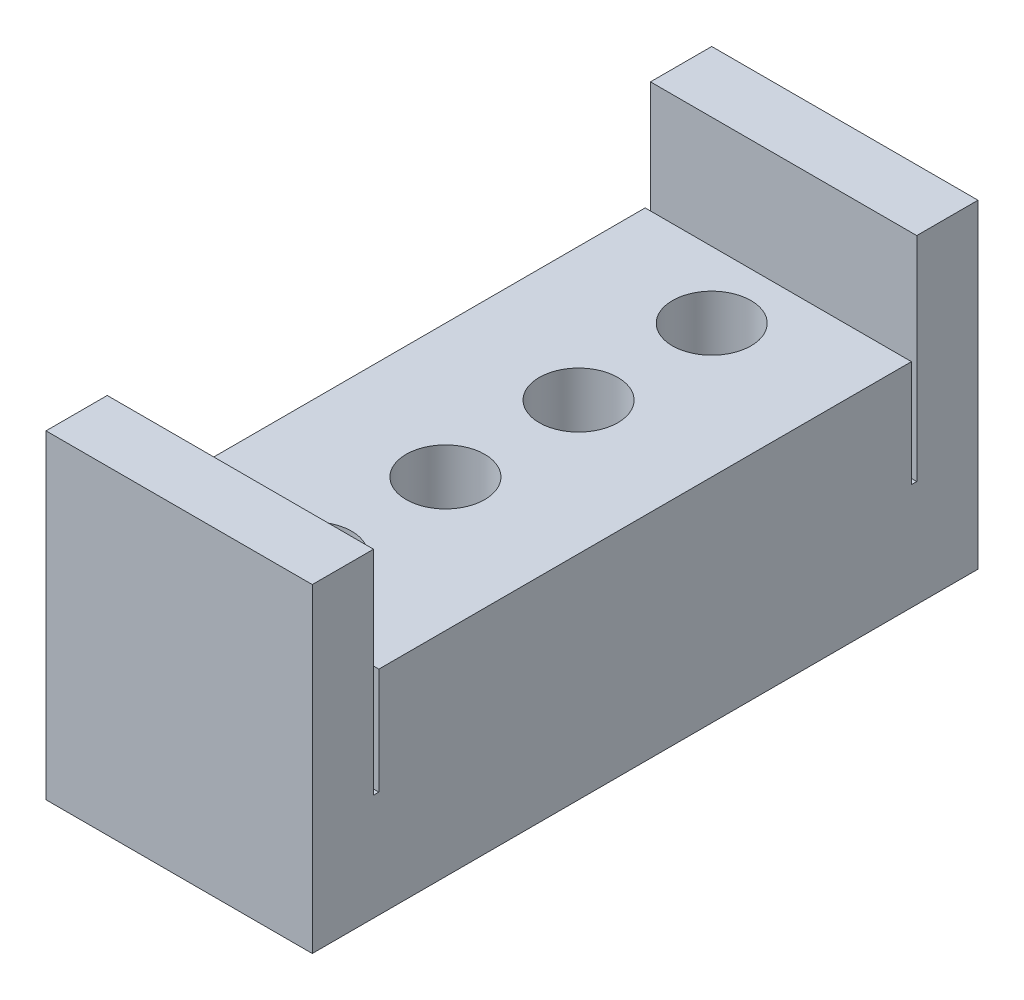
ISO-10303-21;
HEADER;
FILE_DESCRIPTION(('STEP AP214'),'2;1');
FILE_NAME('part.step','',(''),(''),'','','');
FILE_SCHEMA(('AUTOMOTIVE_DESIGN { 1 0 10303 214 1 1 1 1 }'));
ENDSEC;
DATA;
#1=APPLICATION_CONTEXT('core data for automotive mechanical design processes');
#2=APPLICATION_PROTOCOL_DEFINITION('international standard','automotive_design',2000,#1);
#3=PRODUCT_CONTEXT('',#1,'mechanical');
#4=PRODUCT('Part','Part','',(#3));
#5=PRODUCT_RELATED_PRODUCT_CATEGORY('part','',(#4));
#6=PRODUCT_DEFINITION_FORMATION('','',#4);
#7=PRODUCT_DEFINITION_CONTEXT('part definition',#1,'design');
#8=PRODUCT_DEFINITION('design','',#6,#7);
#9=PRODUCT_DEFINITION_SHAPE('','',#8);
#10=(LENGTH_UNIT() NAMED_UNIT(*) SI_UNIT(.MILLI.,.METRE.));
#11=(NAMED_UNIT(*) PLANE_ANGLE_UNIT() SI_UNIT($,.RADIAN.));
#12=(NAMED_UNIT(*) SI_UNIT($,.STERADIAN.) SOLID_ANGLE_UNIT());
#13=UNCERTAINTY_MEASURE_WITH_UNIT(LENGTH_MEASURE(1.E-05),#10,'distance_accuracy_value','');
#14=(GEOMETRIC_REPRESENTATION_CONTEXT(3) GLOBAL_UNCERTAINTY_ASSIGNED_CONTEXT((#13)) GLOBAL_UNIT_ASSIGNED_CONTEXT((#10,
#11,#12)) REPRESENTATION_CONTEXT('',''));
#15=CARTESIAN_POINT('',(0.,0.,0.));
#16=DIRECTION('',(0.,0.,1.));
#17=DIRECTION('',(1.,0.,0.));
#18=AXIS2_PLACEMENT_3D('',#15,#16,#17);
#19=CARTESIAN_POINT('',(0.,12.1719300090006,-7.5));
#20=DIRECTION('',(0.,-1.,0.));
#21=DIRECTION('',(0.,0.,-1.));
#22=AXIS2_PLACEMENT_3D('',#19,#20,#21);
#23=CYLINDRICAL_SURFACE('',#22,1.475);
#24=CARTESIAN_POINT('',(0.,0.,-7.5));
#25=DIRECTION('',(0.,-1.,0.));
#26=DIRECTION('',(0.,0.,-1.));
#27=AXIS2_PLACEMENT_3D('',#24,#25,#26);
#28=CIRCLE('',#27,1.475);
#29=CARTESIAN_POINT('',(0.,0.,-8.975));
#30=VERTEX_POINT('',#29);
#31=EDGE_CURVE('E48',#30,#30,#28,.T.);
#32=ORIENTED_EDGE('',*,*,#31,.T.);
#33=EDGE_LOOP('',(#32));
#34=FACE_BOUND('',#33,.T.);
#35=CARTESIAN_POINT('',(0.,8.,-7.5));
#36=DIRECTION('',(0.,1.,0.));
#37=DIRECTION('',(0.,0.,1.));
#38=AXIS2_PLACEMENT_3D('',#35,#36,#37);
#39=CIRCLE('',#38,1.475);
#40=CARTESIAN_POINT('',(0.,8.,-6.025));
#41=VERTEX_POINT('',#40);
#42=EDGE_CURVE('E11',#41,#41,#39,.F.);
#43=ORIENTED_EDGE('',*,*,#42,.F.);
#44=EDGE_LOOP('',(#43));
#45=FACE_BOUND('',#44,.T.);
#46=ADVANCED_FACE('F41',(#34,#45),#23,.F.);
#47=CARTESIAN_POINT('',(0.,12.1719300090006,-2.5));
#48=DIRECTION('',(0.,-1.,0.));
#49=DIRECTION('',(0.,0.,-1.));
#50=AXIS2_PLACEMENT_3D('',#47,#48,#49);
#51=CYLINDRICAL_SURFACE('',#50,1.475);
#52=CARTESIAN_POINT('',(0.,0.,-2.5));
#53=DIRECTION('',(0.,-1.,0.));
#54=DIRECTION('',(0.,0.,-1.));
#55=AXIS2_PLACEMENT_3D('',#52,#53,#54);
#56=CIRCLE('',#55,1.475);
#57=CARTESIAN_POINT('',(0.,0.,-3.975));
#58=VERTEX_POINT('',#57);
#59=EDGE_CURVE('E226',#58,#58,#56,.T.);
#60=ORIENTED_EDGE('',*,*,#59,.T.);
#61=EDGE_LOOP('',(#60));
#62=FACE_BOUND('',#61,.T.);
#63=CARTESIAN_POINT('',(0.,8.,-2.5));
#64=DIRECTION('',(0.,1.,0.));
#65=DIRECTION('',(0.,0.,1.));
#66=AXIS2_PLACEMENT_3D('',#63,#64,#65);
#67=CIRCLE('',#66,1.475);
#68=CARTESIAN_POINT('',(0.,8.,-1.025));
#69=VERTEX_POINT('',#68);
#70=EDGE_CURVE('E233',#69,#69,#67,.F.);
#71=ORIENTED_EDGE('',*,*,#70,.F.);
#72=EDGE_LOOP('',(#71));
#73=FACE_BOUND('',#72,.T.);
#74=ADVANCED_FACE('F258',(#62,#73),#51,.F.);
#75=CARTESIAN_POINT('',(5.,8.,-12.5));
#76=DIRECTION('',(-1.,0.,0.));
#77=DIRECTION('',(0.,0.,1.));
#78=AXIS2_PLACEMENT_3D('',#75,#76,#77);
#79=PLANE('',#78);
#80=DIRECTION('',(0.,0.,-1.));
#81=VECTOR('',#80,1.);
#82=CARTESIAN_POINT('',(5.,4.,-10.2));
#83=LINE('',#82,#81);
#84=CARTESIAN_POINT('',(5.,4.,-10.));
#85=VERTEX_POINT('',#84);
#86=CARTESIAN_POINT('',(5.,4.,-10.2));
#87=VERTEX_POINT('',#86);
#88=EDGE_CURVE('E142',#85,#87,#83,.T.);
#89=ORIENTED_EDGE('',*,*,#88,.F.);
#90=DIRECTION('',(0.,1.,0.));
#91=VECTOR('',#90,1.);
#92=CARTESIAN_POINT('',(5.,4.,-10.));
#93=LINE('',#92,#91);
#94=CARTESIAN_POINT('',(5.,8.,-10.));
#95=VERTEX_POINT('',#94);
#96=EDGE_CURVE('E140',#85,#95,#93,.T.);
#97=ORIENTED_EDGE('',*,*,#96,.T.);
#98=DIRECTION('',(0.,0.,-1.));
#99=VECTOR('',#98,1.);
#100=CARTESIAN_POINT('',(5.,8.,-12.5));
#101=LINE('',#100,#99);
#102=CARTESIAN_POINT('',(5.,8.,9.99999999999999));
#103=VERTEX_POINT('',#102);
#104=EDGE_CURVE('E201',#103,#95,#101,.T.);
#105=ORIENTED_EDGE('',*,*,#104,.F.);
#106=DIRECTION('',(0.,1.,0.));
#107=VECTOR('',#106,1.);
#108=CARTESIAN_POINT('',(5.,4.,9.99999999999999));
#109=LINE('',#108,#107);
#110=CARTESIAN_POINT('',(5.,4.,9.99999999999999));
#111=VERTEX_POINT('',#110);
#112=EDGE_CURVE('E163',#111,#103,#109,.T.);
#113=ORIENTED_EDGE('',*,*,#112,.F.);
#114=DIRECTION('',(0.,0.,-1.));
#115=VECTOR('',#114,1.);
#116=CARTESIAN_POINT('',(5.,4.,10.2));
#117=LINE('',#116,#115);
#118=CARTESIAN_POINT('',(5.,4.,10.2));
#119=VERTEX_POINT('',#118);
#120=EDGE_CURVE('E167',#119,#111,#117,.T.);
#121=ORIENTED_EDGE('',*,*,#120,.F.);
#122=DIRECTION('',(0.,-1.,0.));
#123=VECTOR('',#122,1.);
#124=CARTESIAN_POINT('',(5.,12.,10.2));
#125=LINE('',#124,#123);
#126=CARTESIAN_POINT('',(5.,12.,10.2));
#127=VERTEX_POINT('',#126);
#128=EDGE_CURVE('E157',#127,#119,#125,.T.);
#129=ORIENTED_EDGE('',*,*,#128,.F.);
#130=DIRECTION('',(0.,0.,-1.));
#131=VECTOR('',#130,1.);
#132=CARTESIAN_POINT('',(5.,12.,12.5));
#133=LINE('',#132,#131);
#134=CARTESIAN_POINT('',(5.,12.,12.5));
#135=VERTEX_POINT('',#134);
#136=EDGE_CURVE('E197',#135,#127,#133,.T.);
#137=ORIENTED_EDGE('',*,*,#136,.F.);
#138=DIRECTION('',(0.,-1.,0.));
#139=VECTOR('',#138,1.);
#140=CARTESIAN_POINT('',(5.,8.,12.5));
#141=LINE('',#140,#139);
#142=CARTESIAN_POINT('',(5.,0.,12.5));
#143=VERTEX_POINT('',#142);
#144=EDGE_CURVE('E209',#135,#143,#141,.T.);
#145=ORIENTED_EDGE('',*,*,#144,.T.);
#146=DIRECTION('',(0.,0.,-1.));
#147=VECTOR('',#146,1.);
#148=CARTESIAN_POINT('',(5.,0.,-12.5));
#149=LINE('',#148,#147);
#150=CARTESIAN_POINT('',(5.,0.,-12.5));
#151=VERTEX_POINT('',#150);
#152=EDGE_CURVE('E191',#143,#151,#149,.T.);
#153=ORIENTED_EDGE('',*,*,#152,.T.);
#154=DIRECTION('',(0.,-1.,0.));
#155=VECTOR('',#154,1.);
#156=CARTESIAN_POINT('',(5.,8.,-12.5));
#157=LINE('',#156,#155);
#158=CARTESIAN_POINT('',(5.,12.,-12.5));
#159=VERTEX_POINT('',#158);
#160=EDGE_CURVE('E223',#159,#151,#157,.T.);
#161=ORIENTED_EDGE('',*,*,#160,.F.);
#162=DIRECTION('',(0.,0.,-1.));
#163=VECTOR('',#162,1.);
#164=CARTESIAN_POINT('',(5.,12.,-12.5));
#165=LINE('',#164,#163);
#166=CARTESIAN_POINT('',(5.,12.,-10.2));
#167=VERTEX_POINT('',#166);
#168=EDGE_CURVE('E185',#167,#159,#165,.T.);
#169=ORIENTED_EDGE('',*,*,#168,.F.);
#170=DIRECTION('',(0.,-1.,0.));
#171=VECTOR('',#170,1.);
#172=CARTESIAN_POINT('',(5.,12.,-10.2));
#173=LINE('',#172,#171);
#174=EDGE_CURVE('E189',#167,#87,#173,.T.);
#175=ORIENTED_EDGE('',*,*,#174,.T.);
#176=EDGE_LOOP('',(#89,#97,#105,#113,#121,#129,#137,#145,#153,#161,#169,#175));
#177=FACE_BOUND('',#176,.T.);
#178=ADVANCED_FACE('F263',(#177),#79,.F.);
#179=CARTESIAN_POINT('',(-5.,8.,-12.5));
#180=DIRECTION('',(0.,0.,1.));
#181=DIRECTION('',(1.,0.,0.));
#182=AXIS2_PLACEMENT_3D('',#179,#180,#181);
#183=PLANE('',#182);
#184=DIRECTION('',(-1.,0.,0.));
#185=VECTOR('',#184,1.);
#186=CARTESIAN_POINT('',(-5.,0.,-12.5));
#187=LINE('',#186,#185);
#188=CARTESIAN_POINT('',(-5.,0.,-12.5));
#189=VERTEX_POINT('',#188);
#190=EDGE_CURVE('E215',#151,#189,#187,.T.);
#191=ORIENTED_EDGE('',*,*,#190,.T.);
#192=DIRECTION('',(0.,-1.,0.));
#193=VECTOR('',#192,1.);
#194=CARTESIAN_POINT('',(-5.,8.,-12.5));
#195=LINE('',#194,#193);
#196=CARTESIAN_POINT('',(-5.,12.,-12.5));
#197=VERTEX_POINT('',#196);
#198=EDGE_CURVE('E225',#197,#189,#195,.T.);
#199=ORIENTED_EDGE('',*,*,#198,.F.);
#200=DIRECTION('',(-1.,0.,0.));
#201=VECTOR('',#200,1.);
#202=CARTESIAN_POINT('',(-5.,12.,-12.5));
#203=LINE('',#202,#201);
#204=EDGE_CURVE('E184',#159,#197,#203,.T.);
#205=ORIENTED_EDGE('',*,*,#204,.F.);
#206=ORIENTED_EDGE('',*,*,#160,.T.);
#207=EDGE_LOOP('',(#191,#199,#205,#206));
#208=FACE_BOUND('',#207,.T.);
#209=ADVANCED_FACE('F266',(#208),#183,.F.);
#210=CARTESIAN_POINT('',(-5.,8.,-12.5));
#211=DIRECTION('',(1.,0.,0.));
#212=DIRECTION('',(0.,0.,-1.));
#213=AXIS2_PLACEMENT_3D('',#210,#211,#212);
#214=PLANE('',#213);
#215=DIRECTION('',(0.,0.,1.));
#216=VECTOR('',#215,1.);
#217=CARTESIAN_POINT('',(-5.,4.,-10.2));
#218=LINE('',#217,#216);
#219=CARTESIAN_POINT('',(-5.,4.,-10.2));
#220=VERTEX_POINT('',#219);
#221=CARTESIAN_POINT('',(-5.,4.,-10.));
#222=VERTEX_POINT('',#221);
#223=EDGE_CURVE('E145',#220,#222,#218,.T.);
#224=ORIENTED_EDGE('',*,*,#223,.F.);
#225=DIRECTION('',(0.,-1.,0.));
#226=VECTOR('',#225,1.);
#227=CARTESIAN_POINT('',(-5.,12.,-10.2));
#228=LINE('',#227,#226);
#229=CARTESIAN_POINT('',(-5.,12.,-10.2));
#230=VERTEX_POINT('',#229);
#231=EDGE_CURVE('E54',#230,#220,#228,.T.);
#232=ORIENTED_EDGE('',*,*,#231,.F.);
#233=DIRECTION('',(0.,0.,1.));
#234=VECTOR('',#233,1.);
#235=CARTESIAN_POINT('',(-5.,12.,-12.5));
#236=LINE('',#235,#234);
#237=EDGE_CURVE('E176',#197,#230,#236,.T.);
#238=ORIENTED_EDGE('',*,*,#237,.F.);
#239=ORIENTED_EDGE('',*,*,#198,.T.);
#240=DIRECTION('',(0.,0.,1.));
#241=VECTOR('',#240,1.);
#242=CARTESIAN_POINT('',(-5.,0.,-12.5));
#243=LINE('',#242,#241);
#244=CARTESIAN_POINT('',(-5.,0.,12.5));
#245=VERTEX_POINT('',#244);
#246=EDGE_CURVE('E213',#189,#245,#243,.T.);
#247=ORIENTED_EDGE('',*,*,#246,.T.);
#248=DIRECTION('',(0.,-1.,0.));
#249=VECTOR('',#248,1.);
#250=CARTESIAN_POINT('',(-5.,8.,12.5));
#251=LINE('',#250,#249);
#252=CARTESIAN_POINT('',(-5.,12.,12.5));
#253=VERTEX_POINT('',#252);
#254=EDGE_CURVE('E218',#253,#245,#251,.T.);
#255=ORIENTED_EDGE('',*,*,#254,.F.);
#256=DIRECTION('',(0.,0.,1.));
#257=VECTOR('',#256,1.);
#258=CARTESIAN_POINT('',(-5.,12.,12.5));
#259=LINE('',#258,#257);
#260=CARTESIAN_POINT('',(-5.,12.,10.2));
#261=VERTEX_POINT('',#260);
#262=EDGE_CURVE('E179',#261,#253,#259,.T.);
#263=ORIENTED_EDGE('',*,*,#262,.F.);
#264=DIRECTION('',(0.,-1.,0.));
#265=VECTOR('',#264,1.);
#266=CARTESIAN_POINT('',(-5.,12.,10.2));
#267=LINE('',#266,#265);
#268=CARTESIAN_POINT('',(-5.,4.,10.2));
#269=VERTEX_POINT('',#268);
#270=EDGE_CURVE('E192',#261,#269,#267,.T.);
#271=ORIENTED_EDGE('',*,*,#270,.T.);
#272=DIRECTION('',(0.,0.,1.));
#273=VECTOR('',#272,1.);
#274=CARTESIAN_POINT('',(-5.,4.,10.2));
#275=LINE('',#274,#273);
#276=CARTESIAN_POINT('',(-5.,4.,9.99999999999999));
#277=VERTEX_POINT('',#276);
#278=EDGE_CURVE('E166',#277,#269,#275,.T.);
#279=ORIENTED_EDGE('',*,*,#278,.F.);
#280=DIRECTION('',(0.,1.,0.));
#281=VECTOR('',#280,1.);
#282=CARTESIAN_POINT('',(-5.,4.,9.99999999999999));
#283=LINE('',#282,#281);
#284=CARTESIAN_POINT('',(-5.,8.,9.99999999999999));
#285=VERTEX_POINT('',#284);
#286=EDGE_CURVE('E161',#277,#285,#283,.T.);
#287=ORIENTED_EDGE('',*,*,#286,.T.);
#288=DIRECTION('',(0.,0.,1.));
#289=VECTOR('',#288,1.);
#290=CARTESIAN_POINT('',(-5.,8.,-12.5));
#291=LINE('',#290,#289);
#292=CARTESIAN_POINT('',(-5.,8.,-10.));
#293=VERTEX_POINT('',#292);
#294=EDGE_CURVE('E153',#293,#285,#291,.T.);
#295=ORIENTED_EDGE('',*,*,#294,.F.);
#296=DIRECTION('',(0.,1.,0.));
#297=VECTOR('',#296,1.);
#298=CARTESIAN_POINT('',(-5.,4.,-10.));
#299=LINE('',#298,#297);
#300=EDGE_CURVE('E133',#222,#293,#299,.T.);
#301=ORIENTED_EDGE('',*,*,#300,.F.);
#302=EDGE_LOOP('',(#224,#232,#238,#239,#247,#255,#263,#271,#279,#287,#295,#301));
#303=FACE_BOUND('',#302,.T.);
#304=ADVANCED_FACE('F151',(#303),#214,.F.);
#305=CARTESIAN_POINT('',(-5.,8.,12.5));
#306=DIRECTION('',(0.,0.,-1.));
#307=DIRECTION('',(-1.,0.,0.));
#308=AXIS2_PLACEMENT_3D('',#305,#306,#307);
#309=PLANE('',#308);
#310=DIRECTION('',(1.,0.,0.));
#311=VECTOR('',#310,1.);
#312=CARTESIAN_POINT('',(-5.,0.,12.5));
#313=LINE('',#312,#311);
#314=EDGE_CURVE('E210',#245,#143,#313,.T.);
#315=ORIENTED_EDGE('',*,*,#314,.T.);
#316=ORIENTED_EDGE('',*,*,#144,.F.);
#317=DIRECTION('',(1.,0.,0.));
#318=VECTOR('',#317,1.);
#319=CARTESIAN_POINT('',(-5.,12.,12.5));
#320=LINE('',#319,#318);
#321=EDGE_CURVE('E198',#253,#135,#320,.T.);
#322=ORIENTED_EDGE('',*,*,#321,.F.);
#323=ORIENTED_EDGE('',*,*,#254,.T.);
#324=EDGE_LOOP('',(#315,#316,#322,#323));
#325=FACE_BOUND('',#324,.T.);
#326=ADVANCED_FACE('F255',(#325),#309,.F.);
#327=CARTESIAN_POINT('',(0.,8.,0.));
#328=DIRECTION('',(0.,1.,0.));
#329=DIRECTION('',(0.,0.,1.));
#330=AXIS2_PLACEMENT_3D('',#327,#328,#329);
#331=PLANE('',#330);
#332=CARTESIAN_POINT('',(0.,8.,2.5));
#333=DIRECTION('',(0.,1.,0.));
#334=DIRECTION('',(0.,0.,1.));
#335=AXIS2_PLACEMENT_3D('',#332,#333,#334);
#336=CIRCLE('',#335,1.475);
#337=CARTESIAN_POINT('',(0.,8.,3.975));
#338=VERTEX_POINT('',#337);
#339=EDGE_CURVE('E345',#338,#338,#336,.F.);
#340=ORIENTED_EDGE('',*,*,#339,.T.);
#341=EDGE_LOOP('',(#340));
#342=FACE_BOUND('',#341,.T.);
#343=CARTESIAN_POINT('',(0.,8.,7.5));
#344=DIRECTION('',(0.,1.,0.));
#345=DIRECTION('',(0.,0.,1.));
#346=AXIS2_PLACEMENT_3D('',#343,#344,#345);
#347=CIRCLE('',#346,1.475);
#348=CARTESIAN_POINT('',(0.,8.,8.975));
#349=VERTEX_POINT('',#348);
#350=EDGE_CURVE('E164',#349,#349,#347,.F.);
#351=ORIENTED_EDGE('',*,*,#350,.T.);
#352=EDGE_LOOP('',(#351));
#353=FACE_BOUND('',#352,.T.);
#354=DIRECTION('',(1.,0.,0.));
#355=VECTOR('',#354,1.);
#356=CARTESIAN_POINT('',(-5.,8.,-10.));
#357=LINE('',#356,#355);
#358=EDGE_CURVE('E147',#293,#95,#357,.T.);
#359=ORIENTED_EDGE('',*,*,#358,.F.);
#360=ORIENTED_EDGE('',*,*,#294,.T.);
#361=DIRECTION('',(-1.,0.,0.));
#362=VECTOR('',#361,1.);
#363=CARTESIAN_POINT('',(-5.,8.,9.99999999999999));
#364=LINE('',#363,#362);
#365=EDGE_CURVE('E168',#103,#285,#364,.T.);
#366=ORIENTED_EDGE('',*,*,#365,.F.);
#367=ORIENTED_EDGE('',*,*,#104,.T.);
#368=EDGE_LOOP('',(#359,#360,#366,#367));
#369=FACE_BOUND('',#368,.T.);
#370=ORIENTED_EDGE('',*,*,#70,.T.);
#371=EDGE_LOOP('',(#370));
#372=FACE_BOUND('',#371,.T.);
#373=ORIENTED_EDGE('',*,*,#42,.T.);
#374=EDGE_LOOP('',(#373));
#375=FACE_BOUND('',#374,.T.);
#376=ADVANCED_FACE('F241',(#342,#353,#369,#372,#375),#331,.T.);
#377=CARTESIAN_POINT('',(0.,0.,0.));
#378=DIRECTION('',(0.,1.,0.));
#379=DIRECTION('',(0.,0.,1.));
#380=AXIS2_PLACEMENT_3D('',#377,#378,#379);
#381=PLANE('',#380);
#382=CARTESIAN_POINT('',(0.,0.,2.5));
#383=DIRECTION('',(0.,-1.,0.));
#384=DIRECTION('',(0.,0.,-1.));
#385=AXIS2_PLACEMENT_3D('',#382,#383,#384);
#386=CIRCLE('',#385,1.475);
#387=CARTESIAN_POINT('',(0.,0.,1.025));
#388=VERTEX_POINT('',#387);
#389=EDGE_CURVE('E339',#388,#388,#386,.T.);
#390=ORIENTED_EDGE('',*,*,#389,.F.);
#391=EDGE_LOOP('',(#390));
#392=FACE_BOUND('',#391,.T.);
#393=CARTESIAN_POINT('',(0.,0.,7.5));
#394=DIRECTION('',(0.,-1.,0.));
#395=DIRECTION('',(0.,0.,-1.));
#396=AXIS2_PLACEMENT_3D('',#393,#394,#395);
#397=CIRCLE('',#396,1.475);
#398=CARTESIAN_POINT('',(0.,0.,6.025));
#399=VERTEX_POINT('',#398);
#400=EDGE_CURVE('E342',#399,#399,#397,.T.);
#401=ORIENTED_EDGE('',*,*,#400,.F.);
#402=EDGE_LOOP('',(#401));
#403=FACE_BOUND('',#402,.T.);
#404=ORIENTED_EDGE('',*,*,#152,.F.);
#405=ORIENTED_EDGE('',*,*,#314,.F.);
#406=ORIENTED_EDGE('',*,*,#246,.F.);
#407=ORIENTED_EDGE('',*,*,#190,.F.);
#408=EDGE_LOOP('',(#404,#405,#406,#407));
#409=FACE_BOUND('',#408,.T.);
#410=ORIENTED_EDGE('',*,*,#59,.F.);
#411=EDGE_LOOP('',(#410));
#412=FACE_BOUND('',#411,.T.);
#413=ORIENTED_EDGE('',*,*,#31,.F.);
#414=EDGE_LOOP('',(#413));
#415=FACE_BOUND('',#414,.T.);
#416=ADVANCED_FACE('F238',(#392,#403,#409,#412,#415),#381,.F.);
#417=CARTESIAN_POINT('',(-5.,12.,10.2));
#418=DIRECTION('',(0.,0.,1.));
#419=DIRECTION('',(1.,0.,0.));
#420=AXIS2_PLACEMENT_3D('',#417,#418,#419);
#421=PLANE('',#420);
#422=ORIENTED_EDGE('',*,*,#128,.T.);
#423=DIRECTION('',(1.,0.,0.));
#424=VECTOR('',#423,1.);
#425=CARTESIAN_POINT('',(-5.,4.,10.2));
#426=LINE('',#425,#424);
#427=EDGE_CURVE('E175',#269,#119,#426,.T.);
#428=ORIENTED_EDGE('',*,*,#427,.F.);
#429=ORIENTED_EDGE('',*,*,#270,.F.);
#430=DIRECTION('',(-1.,0.,0.));
#431=VECTOR('',#430,1.);
#432=CARTESIAN_POINT('',(-5.,12.,10.2));
#433=LINE('',#432,#431);
#434=EDGE_CURVE('E194',#127,#261,#433,.T.);
#435=ORIENTED_EDGE('',*,*,#434,.F.);
#436=EDGE_LOOP('',(#422,#428,#429,#435));
#437=FACE_BOUND('',#436,.T.);
#438=ADVANCED_FACE('F239',(#437),#421,.F.);
#439=CARTESIAN_POINT('',(0.,12.,0.));
#440=DIRECTION('',(0.,-1.,0.));
#441=DIRECTION('',(0.,0.,-1.));
#442=AXIS2_PLACEMENT_3D('',#439,#440,#441);
#443=PLANE('',#442);
#444=ORIENTED_EDGE('',*,*,#262,.T.);
#445=ORIENTED_EDGE('',*,*,#321,.T.);
#446=ORIENTED_EDGE('',*,*,#136,.T.);
#447=ORIENTED_EDGE('',*,*,#434,.T.);
#448=EDGE_LOOP('',(#444,#445,#446,#447));
#449=FACE_BOUND('',#448,.T.);
#450=ADVANCED_FACE('F248',(#449),#443,.F.);
#451=CARTESIAN_POINT('',(-5.,12.,-10.2));
#452=DIRECTION('',(0.,0.,-1.));
#453=DIRECTION('',(-1.,0.,0.));
#454=AXIS2_PLACEMENT_3D('',#451,#452,#453);
#455=PLANE('',#454);
#456=ORIENTED_EDGE('',*,*,#231,.T.);
#457=DIRECTION('',(-1.,0.,0.));
#458=VECTOR('',#457,1.);
#459=CARTESIAN_POINT('',(-5.,4.,-10.2));
#460=LINE('',#459,#458);
#461=EDGE_CURVE('E146',#87,#220,#460,.T.);
#462=ORIENTED_EDGE('',*,*,#461,.F.);
#463=ORIENTED_EDGE('',*,*,#174,.F.);
#464=DIRECTION('',(1.,0.,0.));
#465=VECTOR('',#464,1.);
#466=CARTESIAN_POINT('',(-5.,12.,-10.2));
#467=LINE('',#466,#465);
#468=EDGE_CURVE('E177',#230,#167,#467,.T.);
#469=ORIENTED_EDGE('',*,*,#468,.F.);
#470=EDGE_LOOP('',(#456,#462,#463,#469));
#471=FACE_BOUND('',#470,.T.);
#472=ADVANCED_FACE('F300',(#471),#455,.F.);
#473=CARTESIAN_POINT('',(0.,12.,0.));
#474=DIRECTION('',(0.,1.,0.));
#475=DIRECTION('',(0.,0.,1.));
#476=AXIS2_PLACEMENT_3D('',#473,#474,#475);
#477=PLANE('',#476);
#478=ORIENTED_EDGE('',*,*,#237,.T.);
#479=ORIENTED_EDGE('',*,*,#468,.T.);
#480=ORIENTED_EDGE('',*,*,#168,.T.);
#481=ORIENTED_EDGE('',*,*,#204,.T.);
#482=EDGE_LOOP('',(#478,#479,#480,#481));
#483=FACE_BOUND('',#482,.T.);
#484=ADVANCED_FACE('F295',(#483),#477,.T.);
#485=CARTESIAN_POINT('',(-5.,4.,9.99999999999999));
#486=DIRECTION('',(0.,0.,-1.));
#487=DIRECTION('',(-1.,0.,0.));
#488=AXIS2_PLACEMENT_3D('',#485,#486,#487);
#489=PLANE('',#488);
#490=ORIENTED_EDGE('',*,*,#365,.T.);
#491=ORIENTED_EDGE('',*,*,#286,.F.);
#492=DIRECTION('',(-1.,0.,0.));
#493=VECTOR('',#492,1.);
#494=CARTESIAN_POINT('',(-5.,4.,9.99999999999999));
#495=LINE('',#494,#493);
#496=EDGE_CURVE('E62',#111,#277,#495,.T.);
#497=ORIENTED_EDGE('',*,*,#496,.F.);
#498=ORIENTED_EDGE('',*,*,#112,.T.);
#499=EDGE_LOOP('',(#490,#491,#497,#498));
#500=FACE_BOUND('',#499,.T.);
#501=ADVANCED_FACE('F304',(#500),#489,.F.);
#502=CARTESIAN_POINT('',(0.,4.,0.));
#503=DIRECTION('',(0.,-1.,0.));
#504=DIRECTION('',(0.,0.,-1.));
#505=AXIS2_PLACEMENT_3D('',#502,#503,#504);
#506=PLANE('',#505);
#507=ORIENTED_EDGE('',*,*,#278,.T.);
#508=ORIENTED_EDGE('',*,*,#427,.T.);
#509=ORIENTED_EDGE('',*,*,#120,.T.);
#510=ORIENTED_EDGE('',*,*,#496,.T.);
#511=EDGE_LOOP('',(#507,#508,#509,#510));
#512=FACE_BOUND('',#511,.T.);
#513=ADVANCED_FACE('F309',(#512),#506,.F.);
#514=CARTESIAN_POINT('',(-5.,4.,-10.));
#515=DIRECTION('',(0.,0.,1.));
#516=DIRECTION('',(1.,0.,0.));
#517=AXIS2_PLACEMENT_3D('',#514,#515,#516);
#518=PLANE('',#517);
#519=ORIENTED_EDGE('',*,*,#358,.T.);
#520=ORIENTED_EDGE('',*,*,#96,.F.);
#521=DIRECTION('',(1.,0.,0.));
#522=VECTOR('',#521,1.);
#523=CARTESIAN_POINT('',(-5.,4.,-10.));
#524=LINE('',#523,#522);
#525=EDGE_CURVE('E129',#222,#85,#524,.T.);
#526=ORIENTED_EDGE('',*,*,#525,.F.);
#527=ORIENTED_EDGE('',*,*,#300,.T.);
#528=EDGE_LOOP('',(#519,#520,#526,#527));
#529=FACE_BOUND('',#528,.T.);
#530=ADVANCED_FACE('F132',(#529),#518,.F.);
#531=CARTESIAN_POINT('',(0.,4.,0.));
#532=DIRECTION('',(0.,1.,0.));
#533=DIRECTION('',(0.,0.,1.));
#534=AXIS2_PLACEMENT_3D('',#531,#532,#533);
#535=PLANE('',#534);
#536=ORIENTED_EDGE('',*,*,#223,.T.);
#537=ORIENTED_EDGE('',*,*,#525,.T.);
#538=ORIENTED_EDGE('',*,*,#88,.T.);
#539=ORIENTED_EDGE('',*,*,#461,.T.);
#540=EDGE_LOOP('',(#536,#537,#538,#539));
#541=FACE_BOUND('',#540,.T.);
#542=ADVANCED_FACE('F143',(#541),#535,.T.);
#543=CARTESIAN_POINT('',(0.,12.1719300090006,7.5));
#544=DIRECTION('',(0.,-1.,0.));
#545=DIRECTION('',(0.,0.,-1.));
#546=AXIS2_PLACEMENT_3D('',#543,#544,#545);
#547=CYLINDRICAL_SURFACE('',#546,1.475);
#548=ORIENTED_EDGE('',*,*,#400,.T.);
#549=EDGE_LOOP('',(#548));
#550=FACE_BOUND('',#549,.T.);
#551=ORIENTED_EDGE('',*,*,#350,.F.);
#552=EDGE_LOOP('',(#551));
#553=FACE_BOUND('',#552,.T.);
#554=ADVANCED_FACE('F330',(#550,#553),#547,.F.);
#555=CARTESIAN_POINT('',(0.,12.1719300090006,2.5));
#556=DIRECTION('',(0.,-1.,0.));
#557=DIRECTION('',(0.,0.,-1.));
#558=AXIS2_PLACEMENT_3D('',#555,#556,#557);
#559=CYLINDRICAL_SURFACE('',#558,1.475);
#560=ORIENTED_EDGE('',*,*,#389,.T.);
#561=EDGE_LOOP('',(#560));
#562=FACE_BOUND('',#561,.T.);
#563=ORIENTED_EDGE('',*,*,#339,.F.);
#564=EDGE_LOOP('',(#563));
#565=FACE_BOUND('',#564,.T.);
#566=ADVANCED_FACE('F335',(#562,#565),#559,.F.);
#567=CLOSED_SHELL('',(#46,#74,#178,#209,#304,#326,#376,#416,#438,#450,#472,#484,#501,#513,#530,
#542,#554,#566));
#568=MANIFOLD_SOLID_BREP('B2',#567);
#569=ADVANCED_BREP_SHAPE_REPRESENTATION('',(#18,#568),#14);
#570=SHAPE_DEFINITION_REPRESENTATION(#9,#569);
ENDSEC;
END-ISO-10303-21;
